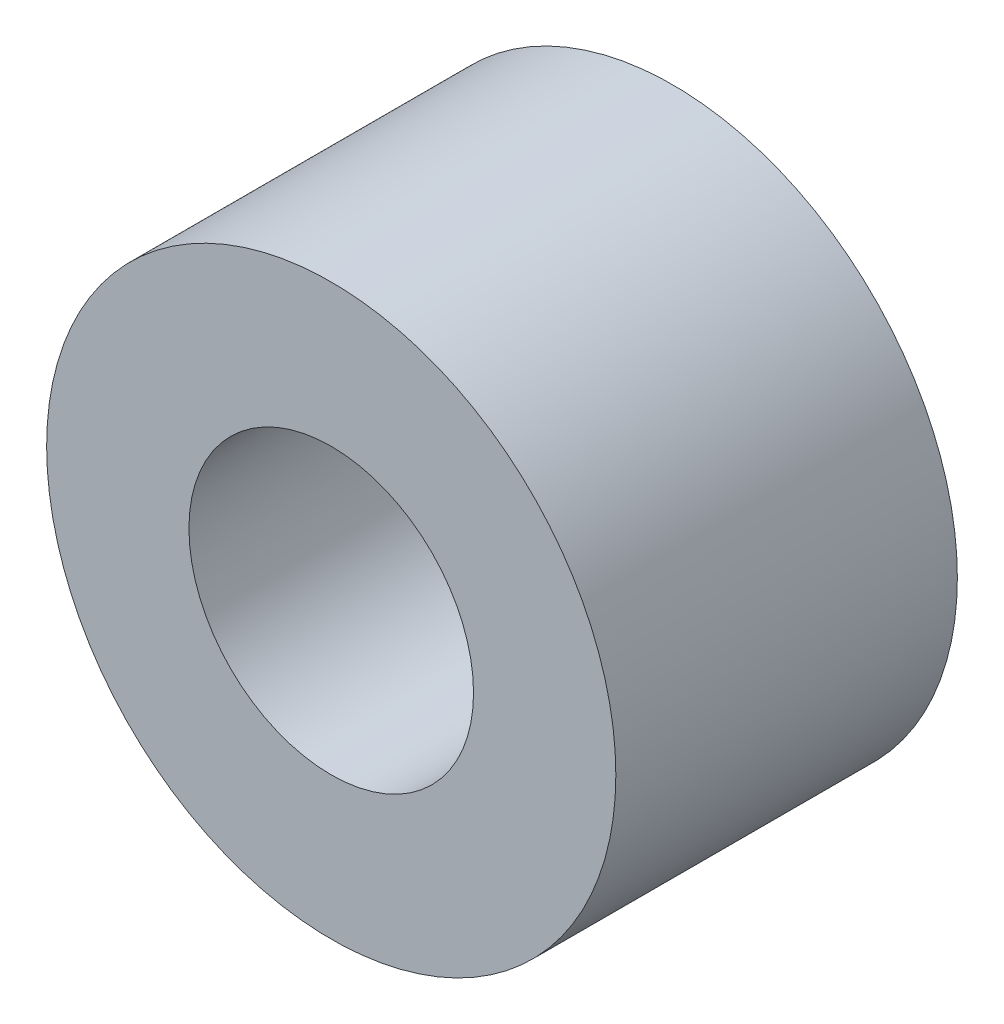
ISO-10303-21;
HEADER;
FILE_DESCRIPTION(('STEP AP214'),'2;1');
FILE_NAME('part.step','',(''),(''),'','','');
FILE_SCHEMA(('AUTOMOTIVE_DESIGN { 1 0 10303 214 1 1 1 1 }'));
ENDSEC;
DATA;
#1=APPLICATION_CONTEXT('core data for automotive mechanical design processes');
#2=APPLICATION_PROTOCOL_DEFINITION('international standard','automotive_design',2000,#1);
#3=PRODUCT_CONTEXT('',#1,'mechanical');
#4=PRODUCT('Part','Part','',(#3));
#5=PRODUCT_RELATED_PRODUCT_CATEGORY('part','',(#4));
#6=PRODUCT_DEFINITION_FORMATION('','',#4);
#7=PRODUCT_DEFINITION_CONTEXT('part definition',#1,'design');
#8=PRODUCT_DEFINITION('design','',#6,#7);
#9=PRODUCT_DEFINITION_SHAPE('','',#8);
#10=(LENGTH_UNIT() NAMED_UNIT(*) SI_UNIT(.MILLI.,.METRE.));
#11=(NAMED_UNIT(*) PLANE_ANGLE_UNIT() SI_UNIT($,.RADIAN.));
#12=(NAMED_UNIT(*) SI_UNIT($,.STERADIAN.) SOLID_ANGLE_UNIT());
#13=UNCERTAINTY_MEASURE_WITH_UNIT(LENGTH_MEASURE(1.E-05),#10,'distance_accuracy_value','');
#14=(GEOMETRIC_REPRESENTATION_CONTEXT(3) GLOBAL_UNCERTAINTY_ASSIGNED_CONTEXT((#13)) GLOBAL_UNIT_ASSIGNED_CONTEXT((#10,
#11,#12)) REPRESENTATION_CONTEXT('',''));
#15=CARTESIAN_POINT('',(0.,0.,0.));
#16=DIRECTION('',(0.,0.,1.));
#17=DIRECTION('',(1.,0.,0.));
#18=AXIS2_PLACEMENT_3D('',#15,#16,#17);
#19=CARTESIAN_POINT('',(-19.85,-19.85,6.));
#20=DIRECTION('',(0.,0.,1.));
#21=DIRECTION('',(1.,0.,0.));
#22=AXIS2_PLACEMENT_3D('',#19,#20,#21);
#23=PLANE('',#22);
#24=CARTESIAN_POINT('',(-19.85,-19.85,6.));
#25=DIRECTION('',(0.,0.,1.));
#26=DIRECTION('',(1.,0.,0.));
#27=AXIS2_PLACEMENT_3D('',#24,#25,#26);
#28=CIRCLE('',#27,5.);
#29=CARTESIAN_POINT('',(-14.85,-19.85,6.));
#30=VERTEX_POINT('',#29);
#31=EDGE_CURVE('E10',#30,#30,#28,.T.);
#32=ORIENTED_EDGE('',*,*,#31,.T.);
#33=EDGE_LOOP('',(#32));
#34=FACE_BOUND('',#33,.T.);
#35=CARTESIAN_POINT('',(-19.85,-19.85,6.));
#36=DIRECTION('',(0.,0.,1.));
#37=DIRECTION('',(1.,0.,0.));
#38=AXIS2_PLACEMENT_3D('',#35,#36,#37);
#39=CIRCLE('',#38,2.5);
#40=CARTESIAN_POINT('',(-17.35,-19.85,6.));
#41=VERTEX_POINT('',#40);
#42=EDGE_CURVE('E42',#41,#41,#39,.T.);
#43=ORIENTED_EDGE('',*,*,#42,.F.);
#44=EDGE_LOOP('',(#43));
#45=FACE_BOUND('',#44,.T.);
#46=ADVANCED_FACE('F31',(#34,#45),#23,.T.);
#47=CARTESIAN_POINT('',(-19.85,-19.85,0.));
#48=DIRECTION('',(0.,0.,1.));
#49=DIRECTION('',(1.,0.,0.));
#50=AXIS2_PLACEMENT_3D('',#47,#48,#49);
#51=PLANE('',#50);
#52=CARTESIAN_POINT('',(-19.85,-19.85,0.));
#53=DIRECTION('',(0.,0.,1.));
#54=DIRECTION('',(1.,0.,0.));
#55=AXIS2_PLACEMENT_3D('',#52,#53,#54);
#56=CIRCLE('',#55,5.);
#57=CARTESIAN_POINT('',(-14.85,-19.85,0.));
#58=VERTEX_POINT('',#57);
#59=EDGE_CURVE('E35',#58,#58,#56,.T.);
#60=ORIENTED_EDGE('',*,*,#59,.F.);
#61=EDGE_LOOP('',(#60));
#62=FACE_BOUND('',#61,.T.);
#63=CARTESIAN_POINT('',(-19.85,-19.85,0.));
#64=DIRECTION('',(0.,0.,1.));
#65=DIRECTION('',(1.,0.,0.));
#66=AXIS2_PLACEMENT_3D('',#63,#64,#65);
#67=CIRCLE('',#66,2.5);
#68=CARTESIAN_POINT('',(-17.35,-19.85,0.));
#69=VERTEX_POINT('',#68);
#70=EDGE_CURVE('E44',#69,#69,#67,.T.);
#71=ORIENTED_EDGE('',*,*,#70,.T.);
#72=EDGE_LOOP('',(#71));
#73=FACE_BOUND('',#72,.T.);
#74=ADVANCED_FACE('F54',(#62,#73),#51,.F.);
#75=CARTESIAN_POINT('',(-19.85,-19.85,6.));
#76=DIRECTION('',(0.,0.,-1.));
#77=DIRECTION('',(-1.,0.,0.));
#78=AXIS2_PLACEMENT_3D('',#75,#76,#77);
#79=CYLINDRICAL_SURFACE('',#78,5.);
#80=ORIENTED_EDGE('',*,*,#31,.F.);
#81=EDGE_LOOP('',(#80));
#82=FACE_BOUND('',#81,.T.);
#83=ORIENTED_EDGE('',*,*,#59,.T.);
#84=EDGE_LOOP('',(#83));
#85=FACE_BOUND('',#84,.T.);
#86=ADVANCED_FACE('F33',(#82,#85),#79,.T.);
#87=CARTESIAN_POINT('',(-19.85,-19.85,6.));
#88=DIRECTION('',(0.,0.,-1.));
#89=DIRECTION('',(-1.,0.,0.));
#90=AXIS2_PLACEMENT_3D('',#87,#88,#89);
#91=CYLINDRICAL_SURFACE('',#90,2.5);
#92=ORIENTED_EDGE('',*,*,#42,.T.);
#93=EDGE_LOOP('',(#92));
#94=FACE_BOUND('',#93,.T.);
#95=ORIENTED_EDGE('',*,*,#70,.F.);
#96=EDGE_LOOP('',(#95));
#97=FACE_BOUND('',#96,.T.);
#98=ADVANCED_FACE('F50',(#94,#97),#91,.F.);
#99=CLOSED_SHELL('',(#46,#74,#86,#98));
#100=MANIFOLD_SOLID_BREP('B2',#99);
#101=ADVANCED_BREP_SHAPE_REPRESENTATION('',(#18,#100),#14);
#102=SHAPE_DEFINITION_REPRESENTATION(#9,#101);
ENDSEC;
END-ISO-10303-21;
